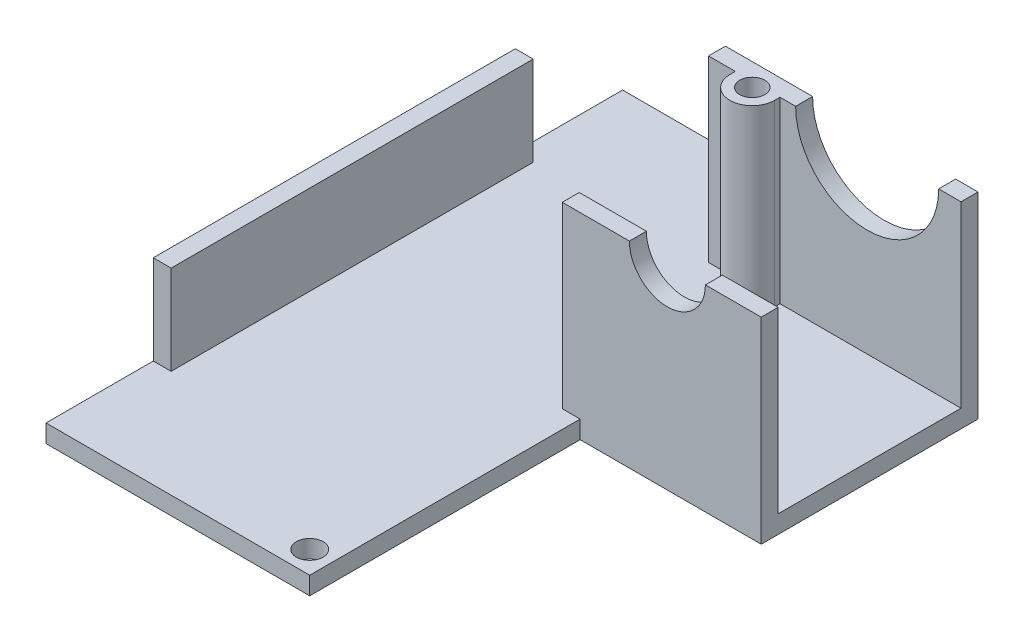
ISO-10303-21;
HEADER;
FILE_DESCRIPTION(('STEP AP214'),'2;1');
FILE_NAME('part.step','',(''),(''),'','','');
FILE_SCHEMA(('AUTOMOTIVE_DESIGN { 1 0 10303 214 1 1 1 1 }'));
ENDSEC;
DATA;
#1=APPLICATION_CONTEXT('core data for automotive mechanical design processes');
#2=APPLICATION_PROTOCOL_DEFINITION('international standard','automotive_design',2000,#1);
#3=PRODUCT_CONTEXT('',#1,'mechanical');
#4=PRODUCT('Part','Part','',(#3));
#5=PRODUCT_RELATED_PRODUCT_CATEGORY('part','',(#4));
#6=PRODUCT_DEFINITION_FORMATION('','',#4);
#7=PRODUCT_DEFINITION_CONTEXT('part definition',#1,'design');
#8=PRODUCT_DEFINITION('design','',#6,#7);
#9=PRODUCT_DEFINITION_SHAPE('','',#8);
#10=(LENGTH_UNIT() NAMED_UNIT(*) SI_UNIT(.MILLI.,.METRE.));
#11=(NAMED_UNIT(*) PLANE_ANGLE_UNIT() SI_UNIT($,.RADIAN.));
#12=(NAMED_UNIT(*) SI_UNIT($,.STERADIAN.) SOLID_ANGLE_UNIT());
#13=UNCERTAINTY_MEASURE_WITH_UNIT(LENGTH_MEASURE(1.E-05),#10,'distance_accuracy_value','');
#14=(GEOMETRIC_REPRESENTATION_CONTEXT(3) GLOBAL_UNCERTAINTY_ASSIGNED_CONTEXT((#13)) GLOBAL_UNIT_ASSIGNED_CONTEXT((#10,
#11,#12)) REPRESENTATION_CONTEXT('',''));
#15=CARTESIAN_POINT('',(0.,0.,0.));
#16=DIRECTION('',(0.,0.,1.));
#17=DIRECTION('',(1.,0.,0.));
#18=AXIS2_PLACEMENT_3D('',#15,#16,#17);
#19=CARTESIAN_POINT('',(27.,22.,12.5));
#20=DIRECTION('',(0.,-1.,0.));
#21=DIRECTION('',(0.,0.,-1.));
#22=AXIS2_PLACEMENT_3D('',#19,#20,#21);
#23=CYLINDRICAL_SURFACE('',#22,2.5);
#24=DIRECTION('',(0.,-1.,0.));
#25=VECTOR('',#24,1.);
#26=CARTESIAN_POINT('',(29.5,22.,12.5));
#27=LINE('',#26,#25);
#28=CARTESIAN_POINT('',(29.5,22.,12.5));
#29=VERTEX_POINT('',#28);
#30=CARTESIAN_POINT('',(29.5,2.,12.5));
#31=VERTEX_POINT('',#30);
#32=EDGE_CURVE('E337',#29,#31,#27,.T.);
#33=ORIENTED_EDGE('',*,*,#32,.F.);
#34=CARTESIAN_POINT('',(27.,22.,12.5));
#35=DIRECTION('',(0.,-1.,0.));
#36=DIRECTION('',(0.,0.,-1.));
#37=AXIS2_PLACEMENT_3D('',#34,#35,#36);
#38=CIRCLE('',#37,2.5);
#39=CARTESIAN_POINT('',(24.5,22.,12.5));
#40=VERTEX_POINT('',#39);
#41=EDGE_CURVE('E50',#40,#29,#38,.F.);
#42=ORIENTED_EDGE('',*,*,#41,.F.);
#43=DIRECTION('',(0.,-1.,0.));
#44=VECTOR('',#43,1.);
#45=CARTESIAN_POINT('',(24.5,22.,12.5));
#46=LINE('',#45,#44);
#47=CARTESIAN_POINT('',(24.5,2.,12.5));
#48=VERTEX_POINT('',#47);
#49=EDGE_CURVE('E217',#48,#40,#46,.F.);
#50=ORIENTED_EDGE('',*,*,#49,.F.);
#51=CARTESIAN_POINT('',(27.,2.,12.5));
#52=DIRECTION('',(0.,-1.,0.));
#53=DIRECTION('',(0.,0.,-1.));
#54=AXIS2_PLACEMENT_3D('',#51,#52,#53);
#55=CIRCLE('',#54,2.5);
#56=EDGE_CURVE('E12',#48,#31,#55,.F.);
#57=ORIENTED_EDGE('',*,*,#56,.T.);
#58=EDGE_LOOP('',(#33,#42,#50,#57));
#59=FACE_BOUND('',#58,.T.);
#60=ADVANCED_FACE('F42',(#59),#23,.T.);
#61=CARTESIAN_POINT('',(0.,2.,0.));
#62=DIRECTION('',(0.,-1.,0.));
#63=DIRECTION('',(0.,0.,-1.));
#64=AXIS2_PLACEMENT_3D('',#61,#62,#63);
#65=PLANE('',#64);
#66=DIRECTION('',(0.,0.,-1.));
#67=VECTOR('',#66,1.);
#68=CARTESIAN_POINT('',(29.5,2.,11.9));
#69=LINE('',#68,#67);
#70=CARTESIAN_POINT('',(29.5,2.,11.9));
#71=VERTEX_POINT('',#70);
#72=EDGE_CURVE('E348',#31,#71,#69,.T.);
#73=ORIENTED_EDGE('',*,*,#72,.F.);
#74=ORIENTED_EDGE('',*,*,#56,.F.);
#75=DIRECTION('',(0.,0.,1.));
#76=VECTOR('',#75,1.);
#77=CARTESIAN_POINT('',(24.5,2.,11.9));
#78=LINE('',#77,#76);
#79=CARTESIAN_POINT('',(24.5,2.,11.9));
#80=VERTEX_POINT('',#79);
#81=EDGE_CURVE('E346',#80,#48,#78,.T.);
#82=ORIENTED_EDGE('',*,*,#81,.F.);
#83=DIRECTION('',(-1.,0.,0.));
#84=VECTOR('',#83,1.);
#85=CARTESIAN_POINT('',(0.,2.,11.9));
#86=LINE('',#85,#84);
#87=CARTESIAN_POINT('',(21.5,2.,11.9));
#88=VERTEX_POINT('',#87);
#89=EDGE_CURVE('E228',#80,#88,#86,.T.);
#90=ORIENTED_EDGE('',*,*,#89,.T.);
#91=DIRECTION('',(0.,0.,1.));
#92=VECTOR('',#91,1.);
#93=CARTESIAN_POINT('',(21.5,2.,0.));
#94=LINE('',#93,#92);
#95=CARTESIAN_POINT('',(21.5,2.,10.));
#96=VERTEX_POINT('',#95);
#97=EDGE_CURVE('E908',#96,#88,#94,.T.);
#98=ORIENTED_EDGE('',*,*,#97,.F.);
#99=DIRECTION('',(-1.,0.,0.));
#100=VECTOR('',#99,1.);
#101=CARTESIAN_POINT('',(0.,2.,10.));
#102=LINE('',#101,#100);
#103=CARTESIAN_POINT('',(23.5,2.,10.));
#104=VERTEX_POINT('',#103);
#105=EDGE_CURVE('E460',#104,#96,#102,.T.);
#106=ORIENTED_EDGE('',*,*,#105,.F.);
#107=DIRECTION('',(0.,0.,-1.));
#108=VECTOR('',#107,1.);
#109=CARTESIAN_POINT('',(23.5,2.,10.));
#110=LINE('',#109,#108);
#111=CARTESIAN_POINT('',(23.5,2.,0.));
#112=VERTEX_POINT('',#111);
#113=EDGE_CURVE('E274',#104,#112,#110,.T.);
#114=ORIENTED_EDGE('',*,*,#113,.T.);
#115=DIRECTION('',(1.,0.,0.));
#116=VECTOR('',#115,1.);
#117=CARTESIAN_POINT('',(0.,2.,0.));
#118=LINE('',#117,#116);
#119=CARTESIAN_POINT('',(0.,2.,0.));
#120=VERTEX_POINT('',#119);
#121=EDGE_CURVE('E439',#120,#112,#118,.T.);
#122=ORIENTED_EDGE('',*,*,#121,.F.);
#123=DIRECTION('',(0.,0.,1.));
#124=VECTOR('',#123,1.);
#125=CARTESIAN_POINT('',(0.,2.,0.));
#126=LINE('',#125,#124);
#127=CARTESIAN_POINT('',(0.,2.,12.));
#128=VERTEX_POINT('',#127);
#129=EDGE_CURVE('E265',#120,#128,#126,.T.);
#130=ORIENTED_EDGE('',*,*,#129,.T.);
#131=DIRECTION('',(1.,0.,0.));
#132=VECTOR('',#131,1.);
#133=CARTESIAN_POINT('',(0.,2.,12.));
#134=LINE('',#133,#132);
#135=CARTESIAN_POINT('',(2.,2.,12.));
#136=VERTEX_POINT('',#135);
#137=EDGE_CURVE('E377',#128,#136,#134,.T.);
#138=ORIENTED_EDGE('',*,*,#137,.T.);
#139=DIRECTION('',(0.,0.,-1.));
#140=VECTOR('',#139,1.);
#141=CARTESIAN_POINT('',(2.,2.,0.));
#142=LINE('',#141,#140);
#143=CARTESIAN_POINT('',(2.,2.,52.5));
#144=VERTEX_POINT('',#143);
#145=EDGE_CURVE('E922',#144,#136,#142,.T.);
#146=ORIENTED_EDGE('',*,*,#145,.F.);
#147=DIRECTION('',(1.,0.,0.));
#148=VECTOR('',#147,1.);
#149=CARTESIAN_POINT('',(0.,2.,52.5));
#150=LINE('',#149,#148);
#151=CARTESIAN_POINT('',(0.,2.,52.5));
#152=VERTEX_POINT('',#151);
#153=EDGE_CURVE('E371',#152,#144,#150,.T.);
#154=ORIENTED_EDGE('',*,*,#153,.F.);
#155=CARTESIAN_POINT('',(0.,2.,64.5));
#156=VERTEX_POINT('',#155);
#157=EDGE_CURVE('E262',#152,#156,#126,.T.);
#158=ORIENTED_EDGE('',*,*,#157,.T.);
#159=DIRECTION('',(1.,0.,0.));
#160=VECTOR('',#159,1.);
#161=CARTESIAN_POINT('',(0.,2.,64.5));
#162=LINE('',#161,#160);
#163=CARTESIAN_POINT('',(29.5,2.,64.5));
#164=VERTEX_POINT('',#163);
#165=EDGE_CURVE('E477',#156,#164,#162,.T.);
#166=ORIENTED_EDGE('',*,*,#165,.T.);
#167=DIRECTION('',(0.,0.,1.));
#168=VECTOR('',#167,1.);
#169=CARTESIAN_POINT('',(29.5,2.,10.));
#170=LINE('',#169,#168);
#171=CARTESIAN_POINT('',(29.5,2.,34.25));
#172=VERTEX_POINT('',#171);
#173=EDGE_CURVE('E298',#172,#164,#170,.T.);
#174=ORIENTED_EDGE('',*,*,#173,.F.);
#175=DIRECTION('',(-1.,0.,0.));
#176=VECTOR('',#175,1.);
#177=CARTESIAN_POINT('',(0.,2.,34.25));
#178=LINE('',#177,#176);
#179=CARTESIAN_POINT('',(27.5,2.,34.25));
#180=VERTEX_POINT('',#179);
#181=EDGE_CURVE('E500',#172,#180,#178,.T.);
#182=ORIENTED_EDGE('',*,*,#181,.T.);
#183=DIRECTION('',(0.,0.,-1.));
#184=VECTOR('',#183,1.);
#185=CARTESIAN_POINT('',(27.5,2.,0.));
#186=LINE('',#185,#184);
#187=CARTESIAN_POINT('',(27.5,2.,32.35));
#188=VERTEX_POINT('',#187);
#189=EDGE_CURVE('E266',#180,#188,#186,.T.);
#190=ORIENTED_EDGE('',*,*,#189,.T.);
#191=DIRECTION('',(-1.,0.,0.));
#192=VECTOR('',#191,1.);
#193=CARTESIAN_POINT('',(0.,2.,32.35));
#194=LINE('',#193,#192);
#195=CARTESIAN_POINT('',(49.75,2.,32.35));
#196=VERTEX_POINT('',#195);
#197=EDGE_CURVE('E504',#196,#188,#194,.T.);
#198=ORIENTED_EDGE('',*,*,#197,.F.);
#199=DIRECTION('',(0.,0.,1.));
#200=VECTOR('',#199,1.);
#201=CARTESIAN_POINT('',(49.75,1.99999999999999,10.));
#202=LINE('',#201,#200);
#203=CARTESIAN_POINT('',(49.75,1.99999999999999,11.9));
#204=VERTEX_POINT('',#203);
#205=EDGE_CURVE('E255',#204,#196,#202,.T.);
#206=ORIENTED_EDGE('',*,*,#205,.F.);
#207=EDGE_CURVE('E888',#204,#71,#86,.T.);
#208=ORIENTED_EDGE('',*,*,#207,.T.);
#209=EDGE_LOOP('',(#73,#74,#82,#90,#98,#106,#114,#122,#130,#138,#146,#154,#158,#166,#174,#182,
#190,#198,#206,#208));
#210=FACE_BOUND('',#209,.T.);
#211=CARTESIAN_POINT('',(27.,2.,62.));
#212=DIRECTION('',(0.,1.,0.));
#213=DIRECTION('',(0.,0.,1.));
#214=AXIS2_PLACEMENT_3D('',#211,#212,#213);
#215=CIRCLE('',#214,1.49999999999999);
#216=CARTESIAN_POINT('',(27.,2.,63.5));
#217=VERTEX_POINT('',#216);
#218=EDGE_CURVE('E649',#217,#217,#215,.T.);
#219=ORIENTED_EDGE('',*,*,#218,.F.);
#220=EDGE_LOOP('',(#219));
#221=FACE_BOUND('',#220,.T.);
#222=ADVANCED_FACE('F456',(#210,#221),#65,.F.);
#223=CARTESIAN_POINT('',(0.,0.,11.9));
#224=DIRECTION('',(0.,0.,1.));
#225=DIRECTION('',(1.,0.,0.));
#226=AXIS2_PLACEMENT_3D('',#223,#224,#225);
#227=PLANE('',#226);
#228=DIRECTION('',(1.,0.,0.));
#229=VECTOR('',#228,1.);
#230=CARTESIAN_POINT('',(21.5,22.,11.9));
#231=LINE('',#230,#229);
#232=CARTESIAN_POINT('',(29.5,22.,11.9));
#233=VERTEX_POINT('',#232);
#234=CARTESIAN_POINT('',(31.25,22.,11.9));
#235=VERTEX_POINT('',#234);
#236=EDGE_CURVE('E237',#233,#235,#231,.T.);
#237=ORIENTED_EDGE('',*,*,#236,.F.);
#238=DIRECTION('',(0.,-1.,0.));
#239=VECTOR('',#238,1.);
#240=CARTESIAN_POINT('',(29.5,22.,11.9));
#241=LINE('',#240,#239);
#242=EDGE_CURVE('E229',#233,#71,#241,.T.);
#243=ORIENTED_EDGE('',*,*,#242,.T.);
#244=ORIENTED_EDGE('',*,*,#207,.F.);
#245=DIRECTION('',(0.,1.,0.));
#246=VECTOR('',#245,1.);
#247=CARTESIAN_POINT('',(49.75,0.,11.9));
#248=LINE('',#247,#246);
#249=CARTESIAN_POINT('',(49.75,22.,11.9));
#250=VERTEX_POINT('',#249);
#251=EDGE_CURVE('E885',#204,#250,#248,.T.);
#252=ORIENTED_EDGE('',*,*,#251,.T.);
#253=CARTESIAN_POINT('',(47.25,22.,11.9));
#254=VERTEX_POINT('',#253);
#255=EDGE_CURVE('E241',#254,#250,#231,.T.);
#256=ORIENTED_EDGE('',*,*,#255,.F.);
#257=CARTESIAN_POINT('',(39.25,22.,11.9));
#258=DIRECTION('',(0.,0.,1.));
#259=DIRECTION('',(1.,0.,0.));
#260=AXIS2_PLACEMENT_3D('',#257,#258,#259);
#261=CIRCLE('',#260,8.);
#262=EDGE_CURVE('E258',#235,#254,#261,.T.);
#263=ORIENTED_EDGE('',*,*,#262,.F.);
#264=EDGE_LOOP('',(#237,#243,#244,#252,#256,#263));
#265=FACE_BOUND('',#264,.T.);
#266=ADVANCED_FACE('F564',(#265),#227,.T.);
#267=ORIENTED_EDGE('',*,*,#89,.F.);
#268=DIRECTION('',(0.,-1.,0.));
#269=VECTOR('',#268,1.);
#270=CARTESIAN_POINT('',(24.5,22.,11.9));
#271=LINE('',#270,#269);
#272=CARTESIAN_POINT('',(24.5,22.,11.9));
#273=VERTEX_POINT('',#272);
#274=EDGE_CURVE('E216',#273,#80,#271,.T.);
#275=ORIENTED_EDGE('',*,*,#274,.F.);
#276=CARTESIAN_POINT('',(21.5,22.,11.9));
#277=VERTEX_POINT('',#276);
#278=EDGE_CURVE('E227',#277,#273,#231,.T.);
#279=ORIENTED_EDGE('',*,*,#278,.F.);
#280=DIRECTION('',(0.,1.,0.));
#281=VECTOR('',#280,1.);
#282=CARTESIAN_POINT('',(21.5,0.,11.9));
#283=LINE('',#282,#281);
#284=EDGE_CURVE('E905',#88,#277,#283,.T.);
#285=ORIENTED_EDGE('',*,*,#284,.F.);
#286=EDGE_LOOP('',(#267,#275,#279,#285));
#287=FACE_BOUND('',#286,.T.);
#288=ADVANCED_FACE('F225',(#287),#227,.T.);
#289=CARTESIAN_POINT('',(27.4999999999999,22.0000000000001,34.25));
#290=DIRECTION('',(0.,1.,0.));
#291=DIRECTION('',(-1.,0.,0.));
#292=AXIS2_PLACEMENT_3D('',#289,#290,#291);
#293=PLANE('',#292);
#294=DIRECTION('',(0.,0.,1.));
#295=VECTOR('',#294,1.);
#296=CARTESIAN_POINT('',(35.005,22.0000000000001,34.25));
#297=LINE('',#296,#295);
#298=CARTESIAN_POINT('',(35.005,22.0000000000001,32.35));
#299=VERTEX_POINT('',#298);
#300=CARTESIAN_POINT('',(35.005,22.0000000000001,34.25));
#301=VERTEX_POINT('',#300);
#302=EDGE_CURVE('E360',#299,#301,#297,.T.);
#303=ORIENTED_EDGE('',*,*,#302,.F.);
#304=DIRECTION('',(1.,0.,0.));
#305=VECTOR('',#304,1.);
#306=CARTESIAN_POINT('',(27.4999999999999,22.0000000000001,32.35));
#307=LINE('',#306,#305);
#308=CARTESIAN_POINT('',(27.4999999999999,22.0000000000001,32.35));
#309=VERTEX_POINT('',#308);
#310=EDGE_CURVE('E510',#309,#299,#307,.T.);
#311=ORIENTED_EDGE('',*,*,#310,.F.);
#312=DIRECTION('',(0.,0.,-1.));
#313=VECTOR('',#312,1.);
#314=CARTESIAN_POINT('',(27.4999999999999,22.0000000000001,34.25));
#315=LINE('',#314,#313);
#316=CARTESIAN_POINT('',(27.4999999999999,22.0000000000001,34.25));
#317=VERTEX_POINT('',#316);
#318=EDGE_CURVE('E332',#317,#309,#315,.T.);
#319=ORIENTED_EDGE('',*,*,#318,.F.);
#320=DIRECTION('',(1.,0.,0.));
#321=VECTOR('',#320,1.);
#322=CARTESIAN_POINT('',(27.4999999999999,22.0000000000001,34.25));
#323=LINE('',#322,#321);
#324=EDGE_CURVE('E325',#317,#301,#323,.T.);
#325=ORIENTED_EDGE('',*,*,#324,.T.);
#326=EDGE_LOOP('',(#303,#311,#319,#325));
#327=FACE_BOUND('',#326,.T.);
#328=ADVANCED_FACE('F543',(#327),#293,.T.);
#329=CARTESIAN_POINT('',(21.5,22.,10.));
#330=DIRECTION('',(0.,-1.,0.));
#331=DIRECTION('',(0.,0.,-1.));
#332=AXIS2_PLACEMENT_3D('',#329,#330,#331);
#333=PLANE('',#332);
#334=CARTESIAN_POINT('',(27.,22.,12.5));
#335=DIRECTION('',(0.,1.,0.));
#336=DIRECTION('',(0.,0.,1.));
#337=AXIS2_PLACEMENT_3D('',#334,#335,#336);
#338=CIRCLE('',#337,1.4);
#339=CARTESIAN_POINT('',(27.,22.,13.9));
#340=VERTEX_POINT('',#339);
#341=EDGE_CURVE('E351',#340,#340,#338,.T.);
#342=ORIENTED_EDGE('',*,*,#341,.F.);
#343=EDGE_LOOP('',(#342));
#344=FACE_BOUND('',#343,.T.);
#345=DIRECTION('',(0.,0.,1.));
#346=VECTOR('',#345,1.);
#347=CARTESIAN_POINT('',(24.5,22.,11.9));
#348=LINE('',#347,#346);
#349=EDGE_CURVE('E212',#273,#40,#348,.T.);
#350=ORIENTED_EDGE('',*,*,#349,.T.);
#351=ORIENTED_EDGE('',*,*,#41,.T.);
#352=DIRECTION('',(0.,0.,-1.));
#353=VECTOR('',#352,1.);
#354=CARTESIAN_POINT('',(29.5,22.,11.9));
#355=LINE('',#354,#353);
#356=EDGE_CURVE('E220',#29,#233,#355,.T.);
#357=ORIENTED_EDGE('',*,*,#356,.T.);
#358=ORIENTED_EDGE('',*,*,#236,.T.);
#359=DIRECTION('',(0.,0.,-1.));
#360=VECTOR('',#359,1.);
#361=CARTESIAN_POINT('',(31.25,22.,10.));
#362=LINE('',#361,#360);
#363=CARTESIAN_POINT('',(31.25,22.,10.));
#364=VERTEX_POINT('',#363);
#365=EDGE_CURVE('E877',#235,#364,#362,.T.);
#366=ORIENTED_EDGE('',*,*,#365,.T.);
#367=DIRECTION('',(1.,0.,0.));
#368=VECTOR('',#367,1.);
#369=CARTESIAN_POINT('',(21.5,22.,10.));
#370=LINE('',#369,#368);
#371=CARTESIAN_POINT('',(21.5,22.,10.));
#372=VERTEX_POINT('',#371);
#373=EDGE_CURVE('E239',#372,#364,#370,.T.);
#374=ORIENTED_EDGE('',*,*,#373,.F.);
#375=DIRECTION('',(0.,0.,1.));
#376=VECTOR('',#375,1.);
#377=CARTESIAN_POINT('',(21.5,22.,10.));
#378=LINE('',#377,#376);
#379=EDGE_CURVE('E235',#372,#277,#378,.T.);
#380=ORIENTED_EDGE('',*,*,#379,.T.);
#381=ORIENTED_EDGE('',*,*,#278,.T.);
#382=EDGE_LOOP('',(#350,#351,#357,#358,#366,#374,#380,#381));
#383=FACE_BOUND('',#382,.T.);
#384=ADVANCED_FACE('F232',(#344,#383),#333,.F.);
#385=CARTESIAN_POINT('',(0.,0.,0.));
#386=DIRECTION('',(0.,-1.,0.));
#387=DIRECTION('',(0.,0.,-1.));
#388=AXIS2_PLACEMENT_3D('',#385,#386,#387);
#389=PLANE('',#388);
#390=CARTESIAN_POINT('',(27.,0.,12.5));
#391=DIRECTION('',(0.,-1.,0.));
#392=DIRECTION('',(0.,0.,-1.));
#393=AXIS2_PLACEMENT_3D('',#390,#391,#392);
#394=CIRCLE('',#393,1.49999999999999);
#395=CARTESIAN_POINT('',(27.,0.,11.));
#396=VERTEX_POINT('',#395);
#397=EDGE_CURVE('E654',#396,#396,#394,.T.);
#398=ORIENTED_EDGE('',*,*,#397,.F.);
#399=EDGE_LOOP('',(#398));
#400=FACE_BOUND('',#399,.T.);
#401=CARTESIAN_POINT('',(27.,0.,62.));
#402=DIRECTION('',(0.,-1.,0.));
#403=DIRECTION('',(0.,0.,-1.));
#404=AXIS2_PLACEMENT_3D('',#401,#402,#403);
#405=CIRCLE('',#404,1.49999999999999);
#406=CARTESIAN_POINT('',(27.,0.,60.5));
#407=VERTEX_POINT('',#406);
#408=EDGE_CURVE('E652',#407,#407,#405,.T.);
#409=ORIENTED_EDGE('',*,*,#408,.F.);
#410=EDGE_LOOP('',(#409));
#411=FACE_BOUND('',#410,.T.);
#412=DIRECTION('',(1.,0.,0.));
#413=VECTOR('',#412,1.);
#414=CARTESIAN_POINT('',(0.,0.,64.5));
#415=LINE('',#414,#413);
#416=CARTESIAN_POINT('',(0.,0.,64.5));
#417=VERTEX_POINT('',#416);
#418=CARTESIAN_POINT('',(29.5,0.,64.5));
#419=VERTEX_POINT('',#418);
#420=EDGE_CURVE('E471',#417,#419,#415,.T.);
#421=ORIENTED_EDGE('',*,*,#420,.F.);
#422=DIRECTION('',(0.,0.,1.));
#423=VECTOR('',#422,1.);
#424=CARTESIAN_POINT('',(0.,0.,0.));
#425=LINE('',#424,#423);
#426=CARTESIAN_POINT('',(0.,0.,0.));
#427=VERTEX_POINT('',#426);
#428=EDGE_CURVE('E427',#427,#417,#425,.T.);
#429=ORIENTED_EDGE('',*,*,#428,.F.);
#430=DIRECTION('',(1.,0.,0.));
#431=VECTOR('',#430,1.);
#432=CARTESIAN_POINT('',(0.,0.,0.));
#433=LINE('',#432,#431);
#434=CARTESIAN_POINT('',(23.5,0.,0.));
#435=VERTEX_POINT('',#434);
#436=EDGE_CURVE('E301',#427,#435,#433,.T.);
#437=ORIENTED_EDGE('',*,*,#436,.T.);
#438=DIRECTION('',(0.,0.,-1.));
#439=VECTOR('',#438,1.);
#440=CARTESIAN_POINT('',(23.5,0.,10.));
#441=LINE('',#440,#439);
#442=CARTESIAN_POINT('',(23.5,0.,10.));
#443=VERTEX_POINT('',#442);
#444=EDGE_CURVE('E277',#443,#435,#441,.T.);
#445=ORIENTED_EDGE('',*,*,#444,.F.);
#446=DIRECTION('',(-1.,0.,0.));
#447=VECTOR('',#446,1.);
#448=CARTESIAN_POINT('',(29.5,0.,10.));
#449=LINE('',#448,#447);
#450=CARTESIAN_POINT('',(49.75,0.,10.));
#451=VERTEX_POINT('',#450);
#452=EDGE_CURVE('E283',#451,#443,#449,.T.);
#453=ORIENTED_EDGE('',*,*,#452,.F.);
#454=DIRECTION('',(0.,0.,-1.));
#455=VECTOR('',#454,1.);
#456=CARTESIAN_POINT('',(49.75,1.07552855510562E-13,34.25));
#457=LINE('',#456,#455);
#458=CARTESIAN_POINT('',(49.75,1.07552855510562E-13,34.25));
#459=VERTEX_POINT('',#458);
#460=EDGE_CURVE('E306',#459,#451,#457,.T.);
#461=ORIENTED_EDGE('',*,*,#460,.F.);
#462=DIRECTION('',(1.,0.,0.));
#463=VECTOR('',#462,1.);
#464=CARTESIAN_POINT('',(27.5,0.,34.25));
#465=LINE('',#464,#463);
#466=CARTESIAN_POINT('',(29.5,0.,34.25));
#467=VERTEX_POINT('',#466);
#468=EDGE_CURVE('E313',#467,#459,#465,.T.);
#469=ORIENTED_EDGE('',*,*,#468,.F.);
#470=DIRECTION('',(0.,0.,1.));
#471=VECTOR('',#470,1.);
#472=CARTESIAN_POINT('',(29.5,0.,10.));
#473=LINE('',#472,#471);
#474=EDGE_CURVE('E288',#467,#419,#473,.T.);
#475=ORIENTED_EDGE('',*,*,#474,.T.);
#476=EDGE_LOOP('',(#421,#429,#437,#445,#453,#461,#469,#475));
#477=FACE_BOUND('',#476,.T.);
#478=ADVANCED_FACE('F467',(#400,#411,#477),#389,.T.);
#479=CARTESIAN_POINT('',(0.,0.,0.));
#480=DIRECTION('',(-1.,0.,0.));
#481=DIRECTION('',(0.,0.,1.));
#482=AXIS2_PLACEMENT_3D('',#479,#480,#481);
#483=PLANE('',#482);
#484=ORIENTED_EDGE('',*,*,#428,.T.);
#485=DIRECTION('',(0.,1.,0.));
#486=VECTOR('',#485,1.);
#487=CARTESIAN_POINT('',(0.,0.,64.5));
#488=LINE('',#487,#486);
#489=EDGE_CURVE('E431',#417,#156,#488,.T.);
#490=ORIENTED_EDGE('',*,*,#489,.T.);
#491=ORIENTED_EDGE('',*,*,#157,.F.);
#492=DIRECTION('',(0.,1.,0.));
#493=VECTOR('',#492,1.);
#494=CARTESIAN_POINT('',(0.,0.,52.5));
#495=LINE('',#494,#493);
#496=CARTESIAN_POINT('',(0.,12.,52.5));
#497=VERTEX_POINT('',#496);
#498=EDGE_CURVE('E368',#152,#497,#495,.T.);
#499=ORIENTED_EDGE('',*,*,#498,.T.);
#500=DIRECTION('',(0.,0.,-1.));
#501=VECTOR('',#500,1.);
#502=CARTESIAN_POINT('',(0.,12.,52.5));
#503=LINE('',#502,#501);
#504=CARTESIAN_POINT('',(0.,12.,12.));
#505=VERTEX_POINT('',#504);
#506=EDGE_CURVE('E365',#497,#505,#503,.T.);
#507=ORIENTED_EDGE('',*,*,#506,.T.);
#508=DIRECTION('',(0.,1.,0.));
#509=VECTOR('',#508,1.);
#510=CARTESIAN_POINT('',(0.,0.,12.));
#511=LINE('',#510,#509);
#512=EDGE_CURVE('E379',#128,#505,#511,.T.);
#513=ORIENTED_EDGE('',*,*,#512,.F.);
#514=ORIENTED_EDGE('',*,*,#129,.F.);
#515=DIRECTION('',(0.,1.,0.));
#516=VECTOR('',#515,1.);
#517=CARTESIAN_POINT('',(0.,0.,0.));
#518=LINE('',#517,#516);
#519=EDGE_CURVE('E425',#427,#120,#518,.T.);
#520=ORIENTED_EDGE('',*,*,#519,.F.);
#521=EDGE_LOOP('',(#484,#490,#491,#499,#507,#513,#514,#520));
#522=FACE_BOUND('',#521,.T.);
#523=ADVANCED_FACE('F422',(#522),#483,.T.);
#524=CARTESIAN_POINT('',(0.,0.,64.5));
#525=DIRECTION('',(0.,0.,1.));
#526=DIRECTION('',(1.,0.,0.));
#527=AXIS2_PLACEMENT_3D('',#524,#525,#526);
#528=PLANE('',#527);
#529=ORIENTED_EDGE('',*,*,#165,.F.);
#530=ORIENTED_EDGE('',*,*,#489,.F.);
#531=ORIENTED_EDGE('',*,*,#420,.T.);
#532=DIRECTION('',(0.,1.,0.));
#533=VECTOR('',#532,1.);
#534=CARTESIAN_POINT('',(29.5,0.,64.5));
#535=LINE('',#534,#533);
#536=EDGE_CURVE('E483',#419,#164,#535,.T.);
#537=ORIENTED_EDGE('',*,*,#536,.T.);
#538=EDGE_LOOP('',(#529,#530,#531,#537));
#539=FACE_BOUND('',#538,.T.);
#540=ADVANCED_FACE('F481',(#539),#528,.T.);
#541=CARTESIAN_POINT('',(29.5,0.,10.));
#542=DIRECTION('',(0.,0.,-1.));
#543=DIRECTION('',(-1.,0.,0.));
#544=AXIS2_PLACEMENT_3D('',#541,#542,#543);
#545=PLANE('',#544);
#546=CARTESIAN_POINT('',(39.25,22.,10.));
#547=DIRECTION('',(0.,0.,-1.));
#548=DIRECTION('',(-1.,0.,0.));
#549=AXIS2_PLACEMENT_3D('',#546,#547,#548);
#550=CIRCLE('',#549,8.);
#551=CARTESIAN_POINT('',(47.25,22.,10.));
#552=VERTEX_POINT('',#551);
#553=EDGE_CURVE('E882',#552,#364,#550,.T.);
#554=ORIENTED_EDGE('',*,*,#553,.F.);
#555=CARTESIAN_POINT('',(49.75,22.,10.));
#556=VERTEX_POINT('',#555);
#557=EDGE_CURVE('E236',#552,#556,#370,.T.);
#558=ORIENTED_EDGE('',*,*,#557,.T.);
#559=DIRECTION('',(0.,1.,0.));
#560=VECTOR('',#559,1.);
#561=CARTESIAN_POINT('',(49.75,0.,10.));
#562=LINE('',#561,#560);
#563=EDGE_CURVE('E893',#451,#556,#562,.T.);
#564=ORIENTED_EDGE('',*,*,#563,.F.);
#565=ORIENTED_EDGE('',*,*,#452,.T.);
#566=DIRECTION('',(0.,1.,0.));
#567=VECTOR('',#566,1.);
#568=CARTESIAN_POINT('',(23.5,0.,10.));
#569=LINE('',#568,#567);
#570=EDGE_CURVE('E278',#443,#104,#569,.T.);
#571=ORIENTED_EDGE('',*,*,#570,.T.);
#572=ORIENTED_EDGE('',*,*,#105,.T.);
#573=DIRECTION('',(0.,1.,0.));
#574=VECTOR('',#573,1.);
#575=CARTESIAN_POINT('',(21.5,0.,10.));
#576=LINE('',#575,#574);
#577=EDGE_CURVE('E915',#96,#372,#576,.T.);
#578=ORIENTED_EDGE('',*,*,#577,.T.);
#579=ORIENTED_EDGE('',*,*,#373,.T.);
#580=EDGE_LOOP('',(#554,#558,#564,#565,#571,#572,#578,#579));
#581=FACE_BOUND('',#580,.T.);
#582=ADVANCED_FACE('F575',(#581),#545,.T.);
#583=CARTESIAN_POINT('',(23.5,0.,10.));
#584=DIRECTION('',(1.,0.,0.));
#585=DIRECTION('',(0.,0.,-1.));
#586=AXIS2_PLACEMENT_3D('',#583,#584,#585);
#587=PLANE('',#586);
#588=ORIENTED_EDGE('',*,*,#113,.F.);
#589=ORIENTED_EDGE('',*,*,#570,.F.);
#590=ORIENTED_EDGE('',*,*,#444,.T.);
#591=DIRECTION('',(0.,1.,0.));
#592=VECTOR('',#591,1.);
#593=CARTESIAN_POINT('',(23.5,0.,0.));
#594=LINE('',#593,#592);
#595=EDGE_CURVE('E444',#435,#112,#594,.T.);
#596=ORIENTED_EDGE('',*,*,#595,.T.);
#597=EDGE_LOOP('',(#588,#589,#590,#596));
#598=FACE_BOUND('',#597,.T.);
#599=ADVANCED_FACE('F463',(#598),#587,.T.);
#600=CARTESIAN_POINT('',(0.,0.,0.));
#601=DIRECTION('',(0.,0.,1.));
#602=DIRECTION('',(1.,0.,0.));
#603=AXIS2_PLACEMENT_3D('',#600,#601,#602);
#604=PLANE('',#603);
#605=ORIENTED_EDGE('',*,*,#121,.T.);
#606=ORIENTED_EDGE('',*,*,#595,.F.);
#607=ORIENTED_EDGE('',*,*,#436,.F.);
#608=ORIENTED_EDGE('',*,*,#519,.T.);
#609=EDGE_LOOP('',(#605,#606,#607,#608));
#610=FACE_BOUND('',#609,.T.);
#611=ADVANCED_FACE('F455',(#610),#604,.F.);
#612=CARTESIAN_POINT('',(29.5,0.,10.));
#613=DIRECTION('',(-1.,0.,0.));
#614=DIRECTION('',(0.,0.,1.));
#615=AXIS2_PLACEMENT_3D('',#612,#613,#614);
#616=PLANE('',#615);
#617=ORIENTED_EDGE('',*,*,#474,.F.);
#618=DIRECTION('',(0.,1.,0.));
#619=VECTOR('',#618,1.);
#620=CARTESIAN_POINT('',(29.5,0.,34.25));
#621=LINE('',#620,#619);
#622=EDGE_CURVE('E260',#467,#172,#621,.T.);
#623=ORIENTED_EDGE('',*,*,#622,.T.);
#624=ORIENTED_EDGE('',*,*,#173,.T.);
#625=ORIENTED_EDGE('',*,*,#536,.F.);
#626=EDGE_LOOP('',(#617,#623,#624,#625));
#627=FACE_BOUND('',#626,.T.);
#628=ADVANCED_FACE('F496',(#627),#616,.F.);
#629=CARTESIAN_POINT('',(27.5,0.,34.25));
#630=DIRECTION('',(-1.,0.,0.));
#631=DIRECTION('',(0.,-1.,0.));
#632=AXIS2_PLACEMENT_3D('',#629,#630,#631);
#633=PLANE('',#632);
#634=ORIENTED_EDGE('',*,*,#189,.F.);
#635=DIRECTION('',(0.,1.,0.));
#636=VECTOR('',#635,1.);
#637=CARTESIAN_POINT('',(27.5,0.,34.25));
#638=LINE('',#637,#636);
#639=EDGE_CURVE('E318',#180,#317,#638,.T.);
#640=ORIENTED_EDGE('',*,*,#639,.T.);
#641=ORIENTED_EDGE('',*,*,#318,.T.);
#642=DIRECTION('',(0.,1.,0.));
#643=VECTOR('',#642,1.);
#644=CARTESIAN_POINT('',(27.5,0.,32.35));
#645=LINE('',#644,#643);
#646=EDGE_CURVE('E328',#188,#309,#645,.T.);
#647=ORIENTED_EDGE('',*,*,#646,.F.);
#648=EDGE_LOOP('',(#634,#640,#641,#647));
#649=FACE_BOUND('',#648,.T.);
#650=ADVANCED_FACE('F545',(#649),#633,.T.);
#651=CARTESIAN_POINT('',(0.,0.,32.35));
#652=DIRECTION('',(0.,0.,1.));
#653=DIRECTION('',(1.,0.,0.));
#654=AXIS2_PLACEMENT_3D('',#651,#652,#653);
#655=PLANE('',#654);
#656=ORIENTED_EDGE('',*,*,#310,.T.);
#657=CARTESIAN_POINT('',(39.255,22.,32.35));
#658=DIRECTION('',(0.,0.,1.));
#659=DIRECTION('',(1.,0.,0.));
#660=AXIS2_PLACEMENT_3D('',#657,#658,#659);
#661=CIRCLE('',#660,4.25);
#662=CARTESIAN_POINT('',(43.505,22.0000000000002,32.35));
#663=VERTEX_POINT('',#662);
#664=EDGE_CURVE('E259',#299,#663,#661,.T.);
#665=ORIENTED_EDGE('',*,*,#664,.T.);
#666=CARTESIAN_POINT('',(49.7499999999999,22.0000000000002,32.35));
#667=VERTEX_POINT('',#666);
#668=EDGE_CURVE('E267',#663,#667,#307,.T.);
#669=ORIENTED_EDGE('',*,*,#668,.T.);
#670=DIRECTION('',(0.,1.,0.));
#671=VECTOR('',#670,1.);
#672=CARTESIAN_POINT('',(49.75,1.07552855510562E-13,32.35));
#673=LINE('',#672,#671);
#674=EDGE_CURVE('E302',#196,#667,#673,.T.);
#675=ORIENTED_EDGE('',*,*,#674,.F.);
#676=ORIENTED_EDGE('',*,*,#197,.T.);
#677=ORIENTED_EDGE('',*,*,#646,.T.);
#678=EDGE_LOOP('',(#656,#665,#669,#675,#676,#677));
#679=FACE_BOUND('',#678,.T.);
#680=ADVANCED_FACE('F537',(#679),#655,.F.);
#681=CARTESIAN_POINT('',(0.,0.,34.25));
#682=DIRECTION('',(0.,0.,1.));
#683=DIRECTION('',(1.,0.,0.));
#684=AXIS2_PLACEMENT_3D('',#681,#682,#683);
#685=PLANE('',#684);
#686=CARTESIAN_POINT('',(39.255,22.,34.25));
#687=DIRECTION('',(0.,0.,1.));
#688=DIRECTION('',(1.,0.,0.));
#689=AXIS2_PLACEMENT_3D('',#686,#687,#688);
#690=CIRCLE('',#689,4.25);
#691=CARTESIAN_POINT('',(43.505,22.,34.25));
#692=VERTEX_POINT('',#691);
#693=EDGE_CURVE('E356',#301,#692,#690,.T.);
#694=ORIENTED_EDGE('',*,*,#693,.F.);
#695=ORIENTED_EDGE('',*,*,#324,.F.);
#696=ORIENTED_EDGE('',*,*,#639,.F.);
#697=ORIENTED_EDGE('',*,*,#181,.F.);
#698=ORIENTED_EDGE('',*,*,#622,.F.);
#699=ORIENTED_EDGE('',*,*,#468,.T.);
#700=DIRECTION('',(0.,1.,0.));
#701=VECTOR('',#700,1.);
#702=CARTESIAN_POINT('',(49.75,1.07552855510562E-13,34.25));
#703=LINE('',#702,#701);
#704=CARTESIAN_POINT('',(49.7499999999999,22.0000000000002,34.25));
#705=VERTEX_POINT('',#704);
#706=EDGE_CURVE('E305',#459,#705,#703,.T.);
#707=ORIENTED_EDGE('',*,*,#706,.T.);
#708=EDGE_CURVE('E329',#692,#705,#323,.T.);
#709=ORIENTED_EDGE('',*,*,#708,.F.);
#710=EDGE_LOOP('',(#694,#695,#696,#697,#698,#699,#707,#709));
#711=FACE_BOUND('',#710,.T.);
#712=ADVANCED_FACE('F524',(#711),#685,.T.);
#713=CARTESIAN_POINT('',(49.75,1.07552855510562E-13,34.25));
#714=DIRECTION('',(-1.,0.,0.));
#715=DIRECTION('',(0.,-1.,0.));
#716=AXIS2_PLACEMENT_3D('',#713,#714,#715);
#717=PLANE('',#716);
#718=ORIENTED_EDGE('',*,*,#460,.T.);
#719=ORIENTED_EDGE('',*,*,#563,.T.);
#720=DIRECTION('',(0.,0.,1.));
#721=VECTOR('',#720,1.);
#722=CARTESIAN_POINT('',(49.75,22.,10.));
#723=LINE('',#722,#721);
#724=EDGE_CURVE('E890',#556,#250,#723,.T.);
#725=ORIENTED_EDGE('',*,*,#724,.T.);
#726=ORIENTED_EDGE('',*,*,#251,.F.);
#727=ORIENTED_EDGE('',*,*,#205,.T.);
#728=ORIENTED_EDGE('',*,*,#674,.T.);
#729=DIRECTION('',(0.,0.,-1.));
#730=VECTOR('',#729,1.);
#731=CARTESIAN_POINT('',(49.7499999999999,22.0000000000002,34.25));
#732=LINE('',#731,#730);
#733=EDGE_CURVE('E514',#705,#667,#732,.T.);
#734=ORIENTED_EDGE('',*,*,#733,.F.);
#735=ORIENTED_EDGE('',*,*,#706,.F.);
#736=EDGE_LOOP('',(#718,#719,#725,#726,#727,#728,#734,#735));
#737=FACE_BOUND('',#736,.T.);
#738=ADVANCED_FACE('F526',(#737),#717,.F.);
#739=DIRECTION('',(0.,0.,1.));
#740=VECTOR('',#739,1.);
#741=CARTESIAN_POINT('',(43.505,22.0000000000002,34.25));
#742=LINE('',#741,#740);
#743=EDGE_CURVE('E358',#692,#663,#742,.F.);
#744=ORIENTED_EDGE('',*,*,#743,.F.);
#745=ORIENTED_EDGE('',*,*,#708,.T.);
#746=ORIENTED_EDGE('',*,*,#733,.T.);
#747=ORIENTED_EDGE('',*,*,#668,.F.);
#748=EDGE_LOOP('',(#744,#745,#746,#747));
#749=FACE_BOUND('',#748,.T.);
#750=ADVANCED_FACE('F531',(#749),#293,.T.);
#751=CARTESIAN_POINT('',(21.5,0.,10.));
#752=DIRECTION('',(1.,0.,0.));
#753=DIRECTION('',(0.,0.,-1.));
#754=AXIS2_PLACEMENT_3D('',#751,#752,#753);
#755=PLANE('',#754);
#756=ORIENTED_EDGE('',*,*,#577,.F.);
#757=ORIENTED_EDGE('',*,*,#97,.T.);
#758=ORIENTED_EDGE('',*,*,#284,.T.);
#759=ORIENTED_EDGE('',*,*,#379,.F.);
#760=EDGE_LOOP('',(#756,#757,#758,#759));
#761=FACE_BOUND('',#760,.T.);
#762=ADVANCED_FACE('F587',(#761),#755,.F.);
#763=ORIENTED_EDGE('',*,*,#557,.F.);
#764=DIRECTION('',(0.,0.,-1.));
#765=VECTOR('',#764,1.);
#766=CARTESIAN_POINT('',(47.25,22.,10.));
#767=LINE('',#766,#765);
#768=EDGE_CURVE('E874',#552,#254,#767,.F.);
#769=ORIENTED_EDGE('',*,*,#768,.T.);
#770=ORIENTED_EDGE('',*,*,#255,.T.);
#771=ORIENTED_EDGE('',*,*,#724,.F.);
#772=EDGE_LOOP('',(#763,#769,#770,#771));
#773=FACE_BOUND('',#772,.T.);
#774=ADVANCED_FACE('F592',(#773),#333,.F.);
#775=CARTESIAN_POINT('',(39.25,22.,10.));
#776=DIRECTION('',(0.,0.,-1.));
#777=DIRECTION('',(-1.,0.,0.));
#778=AXIS2_PLACEMENT_3D('',#775,#776,#777);
#779=CYLINDRICAL_SURFACE('',#778,8.);
#780=ORIENTED_EDGE('',*,*,#262,.T.);
#781=ORIENTED_EDGE('',*,*,#768,.F.);
#782=ORIENTED_EDGE('',*,*,#553,.T.);
#783=ORIENTED_EDGE('',*,*,#365,.F.);
#784=EDGE_LOOP('',(#780,#781,#782,#783));
#785=FACE_BOUND('',#784,.T.);
#786=ADVANCED_FACE('F605',(#785),#779,.F.);
#787=CARTESIAN_POINT('',(2.,0.,0.));
#788=DIRECTION('',(-1.,0.,0.));
#789=DIRECTION('',(0.,0.,1.));
#790=AXIS2_PLACEMENT_3D('',#787,#788,#789);
#791=PLANE('',#790);
#792=DIRECTION('',(0.,1.,0.));
#793=VECTOR('',#792,1.);
#794=CARTESIAN_POINT('',(2.,0.,52.5));
#795=LINE('',#794,#793);
#796=CARTESIAN_POINT('',(2.,12.,52.5));
#797=VERTEX_POINT('',#796);
#798=EDGE_CURVE('E372',#144,#797,#795,.T.);
#799=ORIENTED_EDGE('',*,*,#798,.F.);
#800=ORIENTED_EDGE('',*,*,#145,.T.);
#801=DIRECTION('',(0.,1.,0.));
#802=VECTOR('',#801,1.);
#803=CARTESIAN_POINT('',(2.,0.,12.));
#804=LINE('',#803,#802);
#805=CARTESIAN_POINT('',(2.,12.,12.));
#806=VERTEX_POINT('',#805);
#807=EDGE_CURVE('E362',#136,#806,#804,.T.);
#808=ORIENTED_EDGE('',*,*,#807,.T.);
#809=DIRECTION('',(0.,0.,-1.));
#810=VECTOR('',#809,1.);
#811=CARTESIAN_POINT('',(2.,12.,52.5));
#812=LINE('',#811,#810);
#813=EDGE_CURVE('E390',#797,#806,#812,.T.);
#814=ORIENTED_EDGE('',*,*,#813,.F.);
#815=EDGE_LOOP('',(#799,#800,#808,#814));
#816=FACE_BOUND('',#815,.T.);
#817=ADVANCED_FACE('F415',(#816),#791,.F.);
#818=CARTESIAN_POINT('',(0.,0.,12.));
#819=DIRECTION('',(0.,0.,-1.));
#820=DIRECTION('',(0.,1.,0.));
#821=AXIS2_PLACEMENT_3D('',#818,#819,#820);
#822=PLANE('',#821);
#823=ORIENTED_EDGE('',*,*,#137,.F.);
#824=ORIENTED_EDGE('',*,*,#512,.T.);
#825=DIRECTION('',(1.,0.,0.));
#826=VECTOR('',#825,1.);
#827=CARTESIAN_POINT('',(0.,12.,12.));
#828=LINE('',#827,#826);
#829=EDGE_CURVE('E387',#505,#806,#828,.T.);
#830=ORIENTED_EDGE('',*,*,#829,.T.);
#831=ORIENTED_EDGE('',*,*,#807,.F.);
#832=EDGE_LOOP('',(#823,#824,#830,#831));
#833=FACE_BOUND('',#832,.T.);
#834=ADVANCED_FACE('F420',(#833),#822,.T.);
#835=CARTESIAN_POINT('',(0.,0.,52.5));
#836=DIRECTION('',(0.,0.,-1.));
#837=DIRECTION('',(-1.,0.,0.));
#838=AXIS2_PLACEMENT_3D('',#835,#836,#837);
#839=PLANE('',#838);
#840=ORIENTED_EDGE('',*,*,#498,.F.);
#841=ORIENTED_EDGE('',*,*,#153,.T.);
#842=ORIENTED_EDGE('',*,*,#798,.T.);
#843=DIRECTION('',(1.,0.,0.));
#844=VECTOR('',#843,1.);
#845=CARTESIAN_POINT('',(0.,12.,52.5));
#846=LINE('',#845,#844);
#847=EDGE_CURVE('E394',#497,#797,#846,.T.);
#848=ORIENTED_EDGE('',*,*,#847,.F.);
#849=EDGE_LOOP('',(#840,#841,#842,#848));
#850=FACE_BOUND('',#849,.T.);
#851=ADVANCED_FACE('F412',(#850),#839,.F.);
#852=CARTESIAN_POINT('',(0.,12.,52.5));
#853=DIRECTION('',(0.,-1.,0.));
#854=DIRECTION('',(0.,0.,-1.));
#855=AXIS2_PLACEMENT_3D('',#852,#853,#854);
#856=PLANE('',#855);
#857=ORIENTED_EDGE('',*,*,#813,.T.);
#858=ORIENTED_EDGE('',*,*,#829,.F.);
#859=ORIENTED_EDGE('',*,*,#506,.F.);
#860=ORIENTED_EDGE('',*,*,#847,.T.);
#861=EDGE_LOOP('',(#857,#858,#859,#860));
#862=FACE_BOUND('',#861,.T.);
#863=ADVANCED_FACE('F417',(#862),#856,.F.);
#864=CARTESIAN_POINT('',(39.255,22.,34.25));
#865=DIRECTION('',(0.,0.,1.));
#866=DIRECTION('',(1.,0.,0.));
#867=AXIS2_PLACEMENT_3D('',#864,#865,#866);
#868=CYLINDRICAL_SURFACE('',#867,4.25);
#869=ORIENTED_EDGE('',*,*,#302,.T.);
#870=ORIENTED_EDGE('',*,*,#693,.T.);
#871=ORIENTED_EDGE('',*,*,#743,.T.);
#872=ORIENTED_EDGE('',*,*,#664,.F.);
#873=EDGE_LOOP('',(#869,#870,#871,#872));
#874=FACE_BOUND('',#873,.T.);
#875=ADVANCED_FACE('F534',(#874),#868,.F.);
#876=CARTESIAN_POINT('',(29.5,22.,11.9));
#877=DIRECTION('',(-1.,0.,0.));
#878=DIRECTION('',(0.,0.,1.));
#879=AXIS2_PLACEMENT_3D('',#876,#877,#878);
#880=PLANE('',#879);
#881=ORIENTED_EDGE('',*,*,#356,.F.);
#882=ORIENTED_EDGE('',*,*,#32,.T.);
#883=ORIENTED_EDGE('',*,*,#72,.T.);
#884=ORIENTED_EDGE('',*,*,#242,.F.);
#885=EDGE_LOOP('',(#881,#882,#883,#884));
#886=FACE_BOUND('',#885,.T.);
#887=ADVANCED_FACE('F343',(#886),#880,.F.);
#888=CARTESIAN_POINT('',(24.5,22.,11.9));
#889=DIRECTION('',(1.,0.,0.));
#890=DIRECTION('',(0.,0.,-1.));
#891=AXIS2_PLACEMENT_3D('',#888,#889,#890);
#892=PLANE('',#891);
#893=ORIENTED_EDGE('',*,*,#81,.T.);
#894=ORIENTED_EDGE('',*,*,#49,.T.);
#895=ORIENTED_EDGE('',*,*,#349,.F.);
#896=ORIENTED_EDGE('',*,*,#274,.T.);
#897=EDGE_LOOP('',(#893,#894,#895,#896));
#898=FACE_BOUND('',#897,.T.);
#899=ADVANCED_FACE('F215',(#898),#892,.F.);
#900=CARTESIAN_POINT('',(27.,22.,12.5));
#901=DIRECTION('',(0.,1.,0.));
#902=DIRECTION('',(0.,0.,1.));
#903=AXIS2_PLACEMENT_3D('',#900,#901,#902);
#904=CYLINDRICAL_SURFACE('',#903,1.4);
#905=CARTESIAN_POINT('',(27.,1.99999999999999,12.5));
#906=DIRECTION('',(0.,-1.,0.));
#907=DIRECTION('',(0.,0.,-1.));
#908=AXIS2_PLACEMENT_3D('',#905,#906,#907);
#909=CIRCLE('',#908,1.4);
#910=CARTESIAN_POINT('',(27.,1.99999999999999,11.1));
#911=VERTEX_POINT('',#910);
#912=EDGE_CURVE('E648',#911,#911,#909,.F.);
#913=ORIENTED_EDGE('',*,*,#912,.F.);
#914=EDGE_LOOP('',(#913));
#915=FACE_BOUND('',#914,.T.);
#916=ORIENTED_EDGE('',*,*,#341,.T.);
#917=EDGE_LOOP('',(#916));
#918=FACE_BOUND('',#917,.T.);
#919=ADVANCED_FACE('F625',(#915,#918),#904,.F.);
#920=CARTESIAN_POINT('',(27.,2.,62.));
#921=DIRECTION('',(0.,1.,0.));
#922=DIRECTION('',(0.,0.,1.));
#923=AXIS2_PLACEMENT_3D('',#920,#921,#922);
#924=CYLINDRICAL_SURFACE('',#923,1.49999999999999);
#925=ORIENTED_EDGE('',*,*,#218,.T.);
#926=EDGE_LOOP('',(#925));
#927=FACE_BOUND('',#926,.T.);
#928=ORIENTED_EDGE('',*,*,#408,.T.);
#929=EDGE_LOOP('',(#928));
#930=FACE_BOUND('',#929,.T.);
#931=ADVANCED_FACE('F628',(#927,#930),#924,.F.);
#932=CARTESIAN_POINT('',(27.,2.,12.5));
#933=DIRECTION('',(0.,-1.,0.));
#934=DIRECTION('',(0.,0.,-1.));
#935=AXIS2_PLACEMENT_3D('',#932,#933,#934);
#936=PLANE('',#935);
#937=CARTESIAN_POINT('',(27.,2.,12.5));
#938=DIRECTION('',(0.,-1.,0.));
#939=DIRECTION('',(0.,0.,-1.));
#940=AXIS2_PLACEMENT_3D('',#937,#938,#939);
#941=CIRCLE('',#940,1.49999999999999);
#942=CARTESIAN_POINT('',(27.,2.,11.));
#943=VERTEX_POINT('',#942);
#944=EDGE_CURVE('E645',#943,#943,#941,.F.);
#945=ORIENTED_EDGE('',*,*,#944,.F.);
#946=EDGE_LOOP('',(#945));
#947=FACE_BOUND('',#946,.T.);
#948=ORIENTED_EDGE('',*,*,#912,.T.);
#949=EDGE_LOOP('',(#948));
#950=FACE_BOUND('',#949,.T.);
#951=ADVANCED_FACE('F632',(#947,#950),#936,.T.);
#952=CARTESIAN_POINT('',(27.,0.,12.5));
#953=DIRECTION('',(0.,-1.,0.));
#954=DIRECTION('',(0.,0.,-1.));
#955=AXIS2_PLACEMENT_3D('',#952,#953,#954);
#956=CYLINDRICAL_SURFACE('',#955,1.49999999999999);
#957=ORIENTED_EDGE('',*,*,#944,.T.);
#958=EDGE_LOOP('',(#957));
#959=FACE_BOUND('',#958,.T.);
#960=ORIENTED_EDGE('',*,*,#397,.T.);
#961=EDGE_LOOP('',(#960));
#962=FACE_BOUND('',#961,.T.);
#963=ADVANCED_FACE('F634',(#959,#962),#956,.F.);
#964=CLOSED_SHELL('',(#60,#222,#266,#288,#328,#384,#478,#523,#540,#582,#599,#611,#628,#650,#680,
#712,#738,#750,#762,#774,#786,#817,#834,#851,#863,#875,#887,#899,#919,#931,#951,#963));
#965=MANIFOLD_SOLID_BREP('B2',#964);
#966=ADVANCED_BREP_SHAPE_REPRESENTATION('',(#18,#965),#14);
#967=SHAPE_DEFINITION_REPRESENTATION(#9,#966);
ENDSEC;
END-ISO-10303-21;
